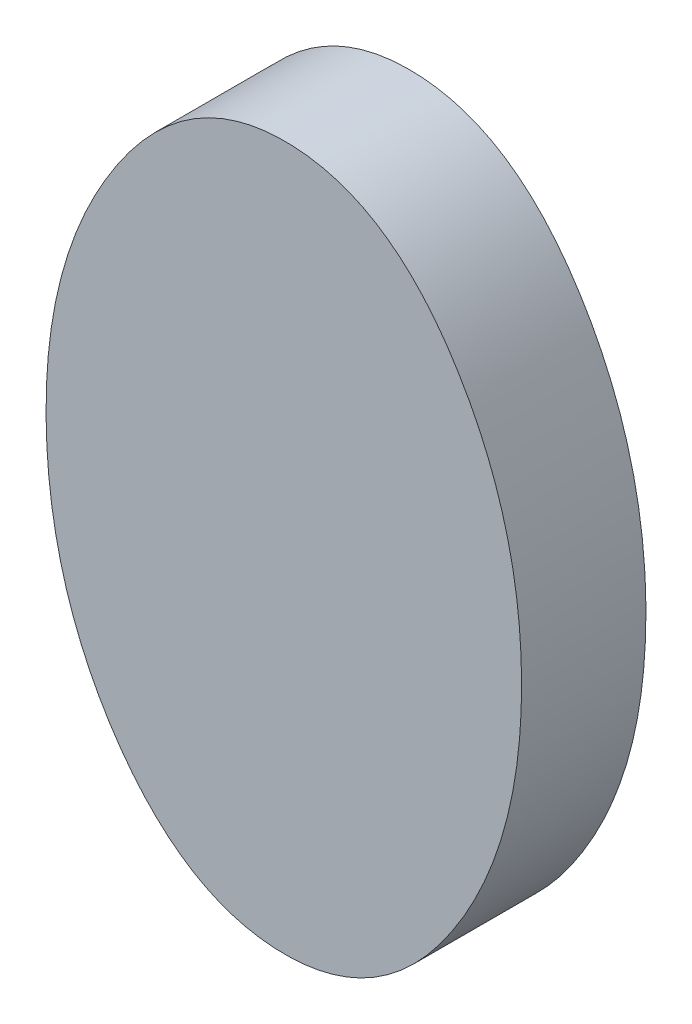
ISO-10303-21;
HEADER;
FILE_DESCRIPTION(('STEP AP214'),'2;1');
FILE_NAME('part.step','',(''),(''),'','','');
FILE_SCHEMA(('AUTOMOTIVE_DESIGN { 1 0 10303 214 1 1 1 1 }'));
ENDSEC;
DATA;
#1=APPLICATION_CONTEXT('core data for automotive mechanical design processes');
#2=APPLICATION_PROTOCOL_DEFINITION('international standard','automotive_design',2000,#1);
#3=PRODUCT_CONTEXT('',#1,'mechanical');
#4=PRODUCT('Part','Part','',(#3));
#5=PRODUCT_RELATED_PRODUCT_CATEGORY('part','',(#4));
#6=PRODUCT_DEFINITION_FORMATION('','',#4);
#7=PRODUCT_DEFINITION_CONTEXT('part definition',#1,'design');
#8=PRODUCT_DEFINITION('design','',#6,#7);
#9=PRODUCT_DEFINITION_SHAPE('','',#8);
#10=(LENGTH_UNIT() NAMED_UNIT(*) SI_UNIT(.MILLI.,.METRE.));
#11=(NAMED_UNIT(*) PLANE_ANGLE_UNIT() SI_UNIT($,.RADIAN.));
#12=(NAMED_UNIT(*) SI_UNIT($,.STERADIAN.) SOLID_ANGLE_UNIT());
#13=UNCERTAINTY_MEASURE_WITH_UNIT(LENGTH_MEASURE(1.E-05),#10,'distance_accuracy_value','');
#14=(GEOMETRIC_REPRESENTATION_CONTEXT(3) GLOBAL_UNCERTAINTY_ASSIGNED_CONTEXT((#13)) GLOBAL_UNIT_ASSIGNED_CONTEXT((#10,
#11,#12)) REPRESENTATION_CONTEXT('',''));
#15=CARTESIAN_POINT('',(0.,0.,0.));
#16=DIRECTION('',(0.,0.,1.));
#17=DIRECTION('',(1.,0.,0.));
#18=AXIS2_PLACEMENT_3D('',#15,#16,#17);
#19=CARTESIAN_POINT('',(-8.95983005625009,-22.770458436575,135.210489149433));
#20=DIRECTION('',(0.,0.,-1.));
#21=DIRECTION('',(0.,-1.,0.));
#22=AXIS2_PLACEMENT_3D('',#19,#20,#21);
#23=PLANE('',#22);
#24=CARTESIAN_POINT('',(-10.7301513887414,-65.57003935891,135.210489149433));
#25=CARTESIAN_POINT('',(-10.7301513887414,-65.3454298885426,135.210489149433));
#26=CARTESIAN_POINT('',(-10.7846763371274,-65.1476761966664,135.210489149433));
#27=CARTESIAN_POINT('',(-11.0027748323449,-64.8058791549763,135.210489149433));
#28=CARTESIAN_POINT('',(-11.1386799074182,-64.72042998391,135.210489149433));
#29=CARTESIAN_POINT('',(-11.4609451509485,-64.72042998391,135.210489149433));
#30=CARTESIAN_POINT('',(-11.5968506932085,-64.8058788479679,135.210489149433));
#31=CARTESIAN_POINT('',(-11.8214596010217,-65.1476759822926,135.210489149433));
#32=CARTESIAN_POINT('',(-11.8776126918167,-65.3454298885426,135.210489149433));
#33=CARTESIAN_POINT('',(-11.8776119447717,-65.80441435891,135.210489149433));
#34=CARTESIAN_POINT('',(-11.8214602572172,-66.0046100199396,135.210489149433));
#35=CARTESIAN_POINT('',(-11.5968502260217,-66.3366407306752,135.210489149433));
#36=CARTESIAN_POINT('',(-11.4609451509485,-66.41964873391,135.210489149433));
#37=CARTESIAN_POINT('',(-11.1419349885949,-66.41964873391,135.210489149433));
#38=CARTESIAN_POINT('',(-11.0068442691956,-66.3354200216582,135.210489149433));
#39=CARTESIAN_POINT('',(-10.7854896760949,-65.998506155785,135.210489149433));
#40=CARTESIAN_POINT('',(-10.7301513887414,-65.7995314510426,135.210489149433));
#41=CARTESIAN_POINT('',(-10.7301513887414,-65.57003935891,135.210489149433));
#42=(BOUNDED_CURVE() B_SPLINE_CURVE(3,(#24,#25,#26,#27,#28,#29,#30,#31,#32,#33,#34,#35,#36,#37,
#38,#39,#40,#41),.UNSPECIFIED.,.T.,.F.) B_SPLINE_CURVE_WITH_KNOTS((4,2,2,2,2,2,2,2,4),(0.,
0.124217334707583,0.248434617574377,0.370167071501347,0.491899204847543,0.618923985709803,
0.745948887307003,0.872974396486983,1.),
.UNSPECIFIED.) CURVE() GEOMETRIC_REPRESENTATION_ITEM() RATIONAL_B_SPLINE_CURVE((1.,1.,1.,1.,1.,
1.,1.,1.,1.,1.,1.,1.,1.,1.,1.,1.,1.,1.)) REPRESENTATION_ITEM(''));
#43=CARTESIAN_POINT('',(-10.7301513887414,-65.57003935891,135.210489149433));
#44=VERTEX_POINT('',#43);
#45=EDGE_CURVE('E11',#44,#44,#42,.T.);
#46=ORIENTED_EDGE('',*,*,#45,.T.);
#47=EDGE_LOOP('',(#46));
#48=FACE_BOUND('',#47,.T.);
#49=ADVANCED_FACE('F43',(#48),#23,.F.);
#50=CARTESIAN_POINT('',(-10.7301513887414,-65.57003935891,135.410489149433));
#51=CARTESIAN_POINT('',(-10.7301513887414,-65.3454298885426,135.410489149433));
#52=CARTESIAN_POINT('',(-10.7846763371274,-65.1476761966664,135.410489149433));
#53=CARTESIAN_POINT('',(-11.0027748323449,-64.8058791549763,135.410489149433));
#54=CARTESIAN_POINT('',(-11.1386799074182,-64.72042998391,135.410489149433));
#55=CARTESIAN_POINT('',(-11.4609451509485,-64.72042998391,135.410489149433));
#56=CARTESIAN_POINT('',(-11.5968506932085,-64.8058788479679,135.410489149433));
#57=CARTESIAN_POINT('',(-11.8214596010217,-65.1476759822926,135.410489149433));
#58=CARTESIAN_POINT('',(-11.8776126918167,-65.3454298885426,135.410489149433));
#59=CARTESIAN_POINT('',(-11.8776119447717,-65.80441435891,135.410489149433));
#60=CARTESIAN_POINT('',(-11.8214602572172,-66.0046100199396,135.410489149433));
#61=CARTESIAN_POINT('',(-11.5968502260217,-66.3366407306752,135.410489149433));
#62=CARTESIAN_POINT('',(-11.4609451509485,-66.41964873391,135.410489149433));
#63=CARTESIAN_POINT('',(-11.1419349885949,-66.41964873391,135.410489149433));
#64=CARTESIAN_POINT('',(-11.0068442691956,-66.3354200216582,135.410489149433));
#65=CARTESIAN_POINT('',(-10.7854896760949,-65.998506155785,135.410489149433));
#66=CARTESIAN_POINT('',(-10.7301513887414,-65.7995314510426,135.410489149433));
#67=CARTESIAN_POINT('',(-10.7301513887414,-65.57003935891,135.410489149433));
#68=(BOUNDED_CURVE() B_SPLINE_CURVE(3,(#50,#51,#52,#53,#54,#55,#56,#57,#58,#59,#60,#61,#62,#63,
#64,#65,#66,#67),.UNSPECIFIED.,.T.,.F.) B_SPLINE_CURVE_WITH_KNOTS((4,2,2,2,2,2,2,2,4),(0.,
0.124217334707583,0.248434617574377,0.370167071501347,0.491899204847543,0.618923985709803,
0.745948887307003,0.872974396486983,1.),
.UNSPECIFIED.) CURVE() GEOMETRIC_REPRESENTATION_ITEM() RATIONAL_B_SPLINE_CURVE((1.,1.,1.,1.,1.,
1.,1.,1.,1.,1.,1.,1.,1.,1.,1.,1.,1.,1.)) REPRESENTATION_ITEM(''));
#69=DIRECTION('',(0.,0.,-1.));
#70=VECTOR('',#69,1.);
#71=SURFACE_OF_LINEAR_EXTRUSION('',#68,#70);
#72=ORIENTED_EDGE('',*,*,#45,.F.);
#73=EDGE_LOOP('',(#72));
#74=FACE_BOUND('',#73,.T.);
#75=CARTESIAN_POINT('',(-10.7301513887414,-65.57003935891,134.910489149433));
#76=CARTESIAN_POINT('',(-10.7301513887414,-65.7995314510426,134.910489149433));
#77=CARTESIAN_POINT('',(-10.7854896760949,-65.998506155785,134.910489149433));
#78=CARTESIAN_POINT('',(-11.0068442691956,-66.3354200216582,134.910489149433));
#79=CARTESIAN_POINT('',(-11.1419349885949,-66.41964873391,134.910489149433));
#80=CARTESIAN_POINT('',(-11.4609451509485,-66.41964873391,134.910489149433));
#81=CARTESIAN_POINT('',(-11.5968502260217,-66.3366407306752,134.910489149433));
#82=CARTESIAN_POINT('',(-11.8214602572172,-66.0046100199396,134.910489149433));
#83=CARTESIAN_POINT('',(-11.8776119447717,-65.80441435891,134.910489149433));
#84=CARTESIAN_POINT('',(-11.8776126918167,-65.3454298885426,134.910489149433));
#85=CARTESIAN_POINT('',(-11.8214596010217,-65.1476759822926,134.910489149433));
#86=CARTESIAN_POINT('',(-11.5968506932085,-64.8058788479679,134.910489149433));
#87=CARTESIAN_POINT('',(-11.4609451509485,-64.72042998391,134.910489149433));
#88=CARTESIAN_POINT('',(-11.1386799074182,-64.72042998391,134.910489149433));
#89=CARTESIAN_POINT('',(-11.0027748323449,-64.8058791549763,134.910489149433));
#90=CARTESIAN_POINT('',(-10.7846763371274,-65.1476761966664,134.910489149433));
#91=CARTESIAN_POINT('',(-10.7301513887414,-65.3454298885426,134.910489149433));
#92=CARTESIAN_POINT('',(-10.7301513887414,-65.57003935891,134.910489149433));
#93=(BOUNDED_CURVE() B_SPLINE_CURVE(3,(#75,#76,#77,#78,#79,#80,#81,#82,#83,#84,#85,#86,#87,#88,
#89,#90,#91,#92),.UNSPECIFIED.,.T.,.F.) B_SPLINE_CURVE_WITH_KNOTS((4,2,2,2,2,2,2,2,4),(0.,
0.127025603513017,0.254051112692997,0.381076014290197,0.508100795152457,0.629832928498653,
0.751565382425623,0.875782665292417,1.),
.UNSPECIFIED.) CURVE() GEOMETRIC_REPRESENTATION_ITEM() RATIONAL_B_SPLINE_CURVE((1.,1.,1.,1.,1.,
1.,1.,1.,1.,1.,1.,1.,1.,1.,1.,1.,1.,1.)) REPRESENTATION_ITEM(''));
#94=CARTESIAN_POINT('',(-10.7301513887414,-65.57003935891,134.910489149433));
#95=VERTEX_POINT('',#94);
#96=EDGE_CURVE('E53',#95,#95,#93,.T.);
#97=ORIENTED_EDGE('',*,*,#96,.F.);
#98=EDGE_LOOP('',(#97));
#99=FACE_BOUND('',#98,.T.);
#100=ADVANCED_FACE('F74',(#74,#99),#71,.F.);
#101=CARTESIAN_POINT('',(-11.8769271440066,-65.6144629655595,134.910489149433));
#102=DIRECTION('',(0.,0.,1.));
#103=DIRECTION('',(1.,0.,0.));
#104=AXIS2_PLACEMENT_3D('',#101,#102,#103);
#105=PLANE('',#104);
#106=ORIENTED_EDGE('',*,*,#96,.T.);
#107=EDGE_LOOP('',(#106));
#108=FACE_BOUND('',#107,.T.);
#109=ADVANCED_FACE('F45',(#108),#105,.F.);
#110=CLOSED_SHELL('',(#49,#100,#109));
#111=MANIFOLD_SOLID_BREP('B2',#110);
#112=ADVANCED_BREP_SHAPE_REPRESENTATION('',(#18,#111),#14);
#113=SHAPE_DEFINITION_REPRESENTATION(#9,#112);
ENDSEC;
END-ISO-10303-21;
